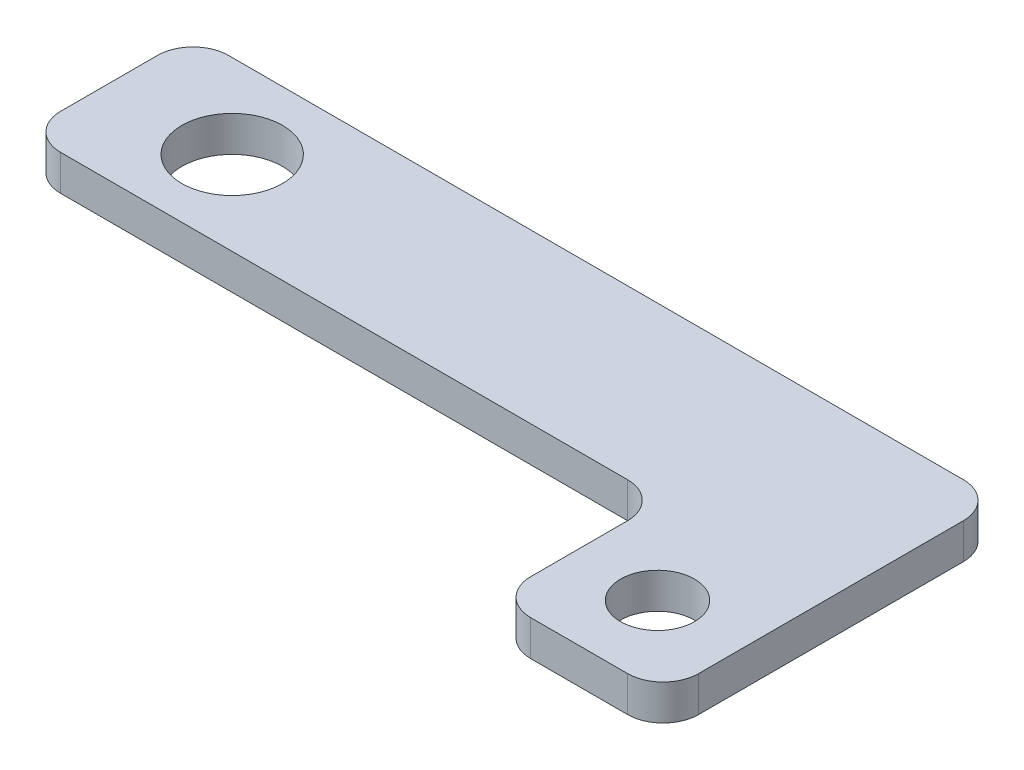
ISO-10303-21;
HEADER;
FILE_DESCRIPTION(('STEP AP214'),'2;1');
FILE_NAME('part.step','',(''),(''),'','','');
FILE_SCHEMA(('AUTOMOTIVE_DESIGN { 1 0 10303 214 1 1 1 1 }'));
ENDSEC;
DATA;
#1=APPLICATION_CONTEXT('core data for automotive mechanical design processes');
#2=APPLICATION_PROTOCOL_DEFINITION('international standard','automotive_design',2000,#1);
#3=PRODUCT_CONTEXT('',#1,'mechanical');
#4=PRODUCT('Part','Part','',(#3));
#5=PRODUCT_RELATED_PRODUCT_CATEGORY('part','',(#4));
#6=PRODUCT_DEFINITION_FORMATION('','',#4);
#7=PRODUCT_DEFINITION_CONTEXT('part definition',#1,'design');
#8=PRODUCT_DEFINITION('design','',#6,#7);
#9=PRODUCT_DEFINITION_SHAPE('','',#8);
#10=(LENGTH_UNIT() NAMED_UNIT(*) SI_UNIT(.MILLI.,.METRE.));
#11=(NAMED_UNIT(*) PLANE_ANGLE_UNIT() SI_UNIT($,.RADIAN.));
#12=(NAMED_UNIT(*) SI_UNIT($,.STERADIAN.) SOLID_ANGLE_UNIT());
#13=UNCERTAINTY_MEASURE_WITH_UNIT(LENGTH_MEASURE(1.E-05),#10,'distance_accuracy_value','');
#14=(GEOMETRIC_REPRESENTATION_CONTEXT(3) GLOBAL_UNCERTAINTY_ASSIGNED_CONTEXT((#13)) GLOBAL_UNIT_ASSIGNED_CONTEXT((#10,
#11,#12)) REPRESENTATION_CONTEXT('',''));
#15=CARTESIAN_POINT('',(0.,0.,0.));
#16=DIRECTION('',(0.,0.,1.));
#17=DIRECTION('',(1.,0.,0.));
#18=AXIS2_PLACEMENT_3D('',#15,#16,#17);
#19=CARTESIAN_POINT('',(56.0000000000009,-3.175,51.0812086000005));
#20=DIRECTION('',(0.,0.,1.));
#21=DIRECTION('',(1.,0.,0.));
#22=AXIS2_PLACEMENT_3D('',#19,#20,#21);
#23=PLANE('',#22);
#24=DIRECTION('',(1.,0.,0.));
#25=VECTOR('',#24,1.);
#26=CARTESIAN_POINT('',(56.0000000000009,-3.175,51.0812086000005));
#27=LINE('',#26,#25);
#28=CARTESIAN_POINT('',(59.1750000000009,-3.175,51.0812086000005));
#29=VERTEX_POINT('',#28);
#30=CARTESIAN_POINT('',(67.8250000000009,-3.175,51.0812086000005));
#31=VERTEX_POINT('',#30);
#32=EDGE_CURVE('E158',#29,#31,#27,.T.);
#33=ORIENTED_EDGE('',*,*,#32,.T.);
#34=DIRECTION('',(0.,1.,0.));
#35=VECTOR('',#34,1.);
#36=CARTESIAN_POINT('',(67.8250000000009,-3.175,51.0812086000005));
#37=LINE('',#36,#35);
#38=CARTESIAN_POINT('',(67.8250000000009,0.,51.0812086000005));
#39=VERTEX_POINT('',#38);
#40=EDGE_CURVE('E202',#31,#39,#37,.T.);
#41=ORIENTED_EDGE('',*,*,#40,.T.);
#42=DIRECTION('',(1.,0.,0.));
#43=VECTOR('',#42,1.);
#44=CARTESIAN_POINT('',(56.0000000000009,0.,51.0812086000005));
#45=LINE('',#44,#43);
#46=CARTESIAN_POINT('',(59.1750000000009,0.,51.0812086000005));
#47=VERTEX_POINT('',#46);
#48=EDGE_CURVE('E136',#47,#39,#45,.T.);
#49=ORIENTED_EDGE('',*,*,#48,.F.);
#50=DIRECTION('',(0.,1.,0.));
#51=VECTOR('',#50,1.);
#52=CARTESIAN_POINT('',(59.1750000000009,-3.175,51.0812086000005));
#53=LINE('',#52,#51);
#54=EDGE_CURVE('E200',#47,#29,#53,.F.);
#55=ORIENTED_EDGE('',*,*,#54,.T.);
#56=EDGE_LOOP('',(#33,#41,#49,#55));
#57=FACE_BOUND('',#56,.T.);
#58=ADVANCED_FACE('F41',(#57),#23,.T.);
#59=CARTESIAN_POINT('',(56.0000000000009,-3.175,44.0812086000005));
#60=DIRECTION('',(-1.,0.,0.));
#61=DIRECTION('',(0.,0.,1.));
#62=AXIS2_PLACEMENT_3D('',#59,#60,#61);
#63=PLANE('',#62);
#64=DIRECTION('',(0.,0.,1.));
#65=VECTOR('',#64,1.);
#66=CARTESIAN_POINT('',(56.0000000000009,0.,44.0812086000005));
#67=LINE('',#66,#65);
#68=CARTESIAN_POINT('',(56.0000000000009,0.,39.2562086000132));
#69=VERTEX_POINT('',#68);
#70=CARTESIAN_POINT('',(56.0000000000009,0.,47.9062086000005));
#71=VERTEX_POINT('',#70);
#72=EDGE_CURVE('E206',#69,#71,#67,.T.);
#73=ORIENTED_EDGE('',*,*,#72,.F.);
#74=DIRECTION('',(0.,1.,0.));
#75=VECTOR('',#74,1.);
#76=CARTESIAN_POINT('',(56.0000000000009,-3.175,39.2562086000132));
#77=LINE('',#76,#75);
#78=CARTESIAN_POINT('',(56.0000000000009,-3.175,39.2562086000132));
#79=VERTEX_POINT('',#78);
#80=EDGE_CURVE('E198',#69,#79,#77,.F.);
#81=ORIENTED_EDGE('',*,*,#80,.T.);
#82=DIRECTION('',(0.,0.,1.));
#83=VECTOR('',#82,1.);
#84=CARTESIAN_POINT('',(56.0000000000009,-3.175,36.0812086000132));
#85=LINE('',#84,#83);
#86=CARTESIAN_POINT('',(56.0000000000009,-3.175,47.9062086000005));
#87=VERTEX_POINT('',#86);
#88=EDGE_CURVE('E162',#79,#87,#85,.T.);
#89=ORIENTED_EDGE('',*,*,#88,.T.);
#90=DIRECTION('',(0.,1.,0.));
#91=VECTOR('',#90,1.);
#92=CARTESIAN_POINT('',(56.0000000000009,-3.175,47.9062086000005));
#93=LINE('',#92,#91);
#94=EDGE_CURVE('E195',#87,#71,#93,.T.);
#95=ORIENTED_EDGE('',*,*,#94,.T.);
#96=EDGE_LOOP('',(#73,#81,#89,#95));
#97=FACE_BOUND('',#96,.T.);
#98=ADVANCED_FACE('F213',(#97),#63,.T.);
#99=CARTESIAN_POINT('',(9.99999999999999,-3.175,36.0812086000132));
#100=DIRECTION('',(0.,0.,1.));
#101=DIRECTION('',(1.,0.,0.));
#102=AXIS2_PLACEMENT_3D('',#99,#100,#101);
#103=PLANE('',#102);
#104=DIRECTION('',(1.,0.,0.));
#105=VECTOR('',#104,1.);
#106=CARTESIAN_POINT('',(9.99999999999999,0.,36.0812086000132));
#107=LINE('',#106,#105);
#108=CARTESIAN_POINT('',(2.17499999999999,0.,36.0812086000132));
#109=VERTEX_POINT('',#108);
#110=CARTESIAN_POINT('',(52.8250000000009,0.,36.0812086000132));
#111=VERTEX_POINT('',#110);
#112=EDGE_CURVE('E208',#109,#111,#107,.T.);
#113=ORIENTED_EDGE('',*,*,#112,.F.);
#114=DIRECTION('',(0.,1.,0.));
#115=VECTOR('',#114,1.);
#116=CARTESIAN_POINT('',(2.17499999999999,-3.175,36.0812086000132));
#117=LINE('',#116,#115);
#118=CARTESIAN_POINT('',(2.17499999999999,-3.175,36.0812086000132));
#119=VERTEX_POINT('',#118);
#120=EDGE_CURVE('E193',#109,#119,#117,.F.);
#121=ORIENTED_EDGE('',*,*,#120,.T.);
#122=DIRECTION('',(1.,0.,0.));
#123=VECTOR('',#122,1.);
#124=CARTESIAN_POINT('',(-1.00000000000001,-3.175,36.0812086000132));
#125=LINE('',#124,#123);
#126=CARTESIAN_POINT('',(52.8250000000009,-3.175,36.0812086000132));
#127=VERTEX_POINT('',#126);
#128=EDGE_CURVE('E222',#119,#127,#125,.T.);
#129=ORIENTED_EDGE('',*,*,#128,.T.);
#130=DIRECTION('',(0.,1.,0.));
#131=VECTOR('',#130,1.);
#132=CARTESIAN_POINT('',(52.8250000000009,0.,36.0812086000132));
#133=LINE('',#132,#131);
#134=EDGE_CURVE('E190',#127,#111,#133,.T.);
#135=ORIENTED_EDGE('',*,*,#134,.T.);
#136=EDGE_LOOP('',(#113,#121,#129,#135));
#137=FACE_BOUND('',#136,.T.);
#138=ADVANCED_FACE('F224',(#137),#103,.T.);
#139=CARTESIAN_POINT('',(-1.00000000000001,-3.175,21.0812086000132));
#140=DIRECTION('',(-1.,0.,0.));
#141=DIRECTION('',(0.,0.,1.));
#142=AXIS2_PLACEMENT_3D('',#139,#140,#141);
#143=PLANE('',#142);
#144=DIRECTION('',(0.,0.,1.));
#145=VECTOR('',#144,1.);
#146=CARTESIAN_POINT('',(-1.00000000000001,0.,21.0812086000132));
#147=LINE('',#146,#145);
#148=CARTESIAN_POINT('',(-1.00000000000001,0.,24.2562086000132));
#149=VERTEX_POINT('',#148);
#150=CARTESIAN_POINT('',(-1.00000000000001,0.,32.9062086000132));
#151=VERTEX_POINT('',#150);
#152=EDGE_CURVE('E235',#149,#151,#147,.T.);
#153=ORIENTED_EDGE('',*,*,#152,.F.);
#154=DIRECTION('',(0.,1.,0.));
#155=VECTOR('',#154,1.);
#156=CARTESIAN_POINT('',(-1.00000000000001,-3.175,24.2562086000132));
#157=LINE('',#156,#155);
#158=CARTESIAN_POINT('',(-1.00000000000001,-3.175,24.2562086000132));
#159=VERTEX_POINT('',#158);
#160=EDGE_CURVE('E63',#149,#159,#157,.F.);
#161=ORIENTED_EDGE('',*,*,#160,.T.);
#162=DIRECTION('',(0.,0.,1.));
#163=VECTOR('',#162,1.);
#164=CARTESIAN_POINT('',(-1.00000000000001,-3.175,21.0812086000132));
#165=LINE('',#164,#163);
#166=CARTESIAN_POINT('',(-1.00000000000001,-3.175,32.9062086000132));
#167=VERTEX_POINT('',#166);
#168=EDGE_CURVE('E226',#159,#167,#165,.T.);
#169=ORIENTED_EDGE('',*,*,#168,.T.);
#170=DIRECTION('',(0.,1.,0.));
#171=VECTOR('',#170,1.);
#172=CARTESIAN_POINT('',(-1.00000000000001,-3.175,32.9062086000132));
#173=LINE('',#172,#171);
#174=EDGE_CURVE('E186',#167,#151,#173,.T.);
#175=ORIENTED_EDGE('',*,*,#174,.T.);
#176=EDGE_LOOP('',(#153,#161,#169,#175));
#177=FACE_BOUND('',#176,.T.);
#178=ADVANCED_FACE('F238',(#177),#143,.T.);
#179=CARTESIAN_POINT('',(9.99999999999998,-3.175,21.0812086000132));
#180=DIRECTION('',(0.,0.,-1.));
#181=DIRECTION('',(-1.,0.,0.));
#182=AXIS2_PLACEMENT_3D('',#179,#180,#181);
#183=PLANE('',#182);
#184=DIRECTION('',(-1.,0.,0.));
#185=VECTOR('',#184,1.);
#186=CARTESIAN_POINT('',(9.99999999999998,0.,21.0812086000132));
#187=LINE('',#186,#185);
#188=CARTESIAN_POINT('',(67.8250000000009,0.,21.0812086000132));
#189=VERTEX_POINT('',#188);
#190=CARTESIAN_POINT('',(2.17499999999999,0.,21.0812086000132));
#191=VERTEX_POINT('',#190);
#192=EDGE_CURVE('E152',#189,#191,#187,.T.);
#193=ORIENTED_EDGE('',*,*,#192,.F.);
#194=DIRECTION('',(0.,1.,0.));
#195=VECTOR('',#194,1.);
#196=CARTESIAN_POINT('',(67.8250000000009,-3.175,21.0812086000132));
#197=LINE('',#196,#195);
#198=CARTESIAN_POINT('',(67.8250000000009,-3.175,21.0812086000132));
#199=VERTEX_POINT('',#198);
#200=EDGE_CURVE('E176',#189,#199,#197,.F.);
#201=ORIENTED_EDGE('',*,*,#200,.T.);
#202=DIRECTION('',(-1.,0.,0.));
#203=VECTOR('',#202,1.);
#204=CARTESIAN_POINT('',(9.99999999999998,-3.175,21.0812086000132));
#205=LINE('',#204,#203);
#206=CARTESIAN_POINT('',(2.17499999999999,-3.175,21.0812086000132));
#207=VERTEX_POINT('',#206);
#208=EDGE_CURVE('E229',#199,#207,#205,.T.);
#209=ORIENTED_EDGE('',*,*,#208,.T.);
#210=DIRECTION('',(0.,1.,0.));
#211=VECTOR('',#210,1.);
#212=CARTESIAN_POINT('',(2.17499999999999,-3.175,21.0812086000132));
#213=LINE('',#212,#211);
#214=EDGE_CURVE('E173',#207,#191,#213,.T.);
#215=ORIENTED_EDGE('',*,*,#214,.T.);
#216=EDGE_LOOP('',(#193,#201,#209,#215));
#217=FACE_BOUND('',#216,.T.);
#218=ADVANCED_FACE('F248',(#217),#183,.T.);
#219=CARTESIAN_POINT('',(71.0000000000009,-3.175,21.0812086000132));
#220=DIRECTION('',(1.,0.,0.));
#221=DIRECTION('',(0.,0.,-1.));
#222=AXIS2_PLACEMENT_3D('',#219,#220,#221);
#223=PLANE('',#222);
#224=DIRECTION('',(0.,0.,-1.));
#225=VECTOR('',#224,1.);
#226=CARTESIAN_POINT('',(71.0000000000009,-3.175,51.0812086000005));
#227=LINE('',#226,#225);
#228=CARTESIAN_POINT('',(71.0000000000009,-3.175,47.9062086000005));
#229=VERTEX_POINT('',#228);
#230=CARTESIAN_POINT('',(71.0000000000009,-3.175,24.2562086000132));
#231=VERTEX_POINT('',#230);
#232=EDGE_CURVE('E250',#229,#231,#227,.T.);
#233=ORIENTED_EDGE('',*,*,#232,.T.);
#234=DIRECTION('',(0.,1.,0.));
#235=VECTOR('',#234,1.);
#236=CARTESIAN_POINT('',(71.0000000000009,-3.175,24.2562086000132));
#237=LINE('',#236,#235);
#238=CARTESIAN_POINT('',(71.0000000000009,0.,24.2562086000132));
#239=VERTEX_POINT('',#238);
#240=EDGE_CURVE('E151',#231,#239,#237,.T.);
#241=ORIENTED_EDGE('',*,*,#240,.T.);
#242=DIRECTION('',(0.,0.,-1.));
#243=VECTOR('',#242,1.);
#244=CARTESIAN_POINT('',(71.0000000000009,0.,21.0812086000132));
#245=LINE('',#244,#243);
#246=CARTESIAN_POINT('',(71.0000000000009,0.,47.9062086000005));
#247=VERTEX_POINT('',#246);
#248=EDGE_CURVE('E134',#247,#239,#245,.T.);
#249=ORIENTED_EDGE('',*,*,#248,.F.);
#250=DIRECTION('',(0.,1.,0.));
#251=VECTOR('',#250,1.);
#252=CARTESIAN_POINT('',(71.0000000000009,-3.175,47.9062086000005));
#253=LINE('',#252,#251);
#254=EDGE_CURVE('E148',#247,#229,#253,.F.);
#255=ORIENTED_EDGE('',*,*,#254,.T.);
#256=EDGE_LOOP('',(#233,#241,#249,#255));
#257=FACE_BOUND('',#256,.T.);
#258=ADVANCED_FACE('F147',(#257),#223,.T.);
#259=CARTESIAN_POINT('',(0.,-3.175,0.));
#260=DIRECTION('',(0.,-1.,0.));
#261=DIRECTION('',(0.,0.,-1.));
#262=AXIS2_PLACEMENT_3D('',#259,#260,#261);
#263=PLANE('',#262);
#264=CARTESIAN_POINT('',(63.5000000000009,-3.175,44.0812086000005));
#265=DIRECTION('',(0.,-1.,0.));
#266=DIRECTION('',(0.,0.,-1.));
#267=AXIS2_PLACEMENT_3D('',#264,#265,#266);
#268=CIRCLE('',#267,3.3);
#269=CARTESIAN_POINT('',(63.5000000000009,-3.175,40.7812086000005));
#270=VERTEX_POINT('',#269);
#271=EDGE_CURVE('E261',#270,#270,#268,.T.);
#272=ORIENTED_EDGE('',*,*,#271,.F.);
#273=EDGE_LOOP('',(#272));
#274=FACE_BOUND('',#273,.T.);
#275=CARTESIAN_POINT('',(9.99999999999999,-3.175,28.5812086000132));
#276=DIRECTION('',(0.,-1.,0.));
#277=DIRECTION('',(0.,0.,-1.));
#278=AXIS2_PLACEMENT_3D('',#275,#276,#277);
#279=CIRCLE('',#278,4.5);
#280=CARTESIAN_POINT('',(9.99999999999999,-3.175,24.0812086000132));
#281=VERTEX_POINT('',#280);
#282=EDGE_CURVE('E255',#281,#281,#279,.T.);
#283=ORIENTED_EDGE('',*,*,#282,.F.);
#284=EDGE_LOOP('',(#283));
#285=FACE_BOUND('',#284,.T.);
#286=ORIENTED_EDGE('',*,*,#208,.F.);
#287=CARTESIAN_POINT('',(67.8250000000009,-3.175,24.2562086000132));
#288=DIRECTION('',(0.,-1.,0.));
#289=DIRECTION('',(0.,0.,-1.));
#290=AXIS2_PLACEMENT_3D('',#287,#288,#289);
#291=CIRCLE('',#290,3.175);
#292=EDGE_CURVE('E184',#199,#231,#291,.T.);
#293=ORIENTED_EDGE('',*,*,#292,.T.);
#294=ORIENTED_EDGE('',*,*,#232,.F.);
#295=CARTESIAN_POINT('',(67.8250000000009,-3.175,47.9062086000005));
#296=DIRECTION('',(0.,-1.,0.));
#297=DIRECTION('',(0.,0.,-1.));
#298=AXIS2_PLACEMENT_3D('',#295,#296,#297);
#299=CIRCLE('',#298,3.175);
#300=EDGE_CURVE('E157',#229,#31,#299,.T.);
#301=ORIENTED_EDGE('',*,*,#300,.T.);
#302=ORIENTED_EDGE('',*,*,#32,.F.);
#303=CARTESIAN_POINT('',(59.1750000000009,-3.175,47.9062086000005));
#304=DIRECTION('',(0.,-1.,0.));
#305=DIRECTION('',(0.,0.,-1.));
#306=AXIS2_PLACEMENT_3D('',#303,#304,#305);
#307=CIRCLE('',#306,3.175);
#308=EDGE_CURVE('E178',#29,#87,#307,.T.);
#309=ORIENTED_EDGE('',*,*,#308,.T.);
#310=ORIENTED_EDGE('',*,*,#88,.F.);
#311=CARTESIAN_POINT('',(52.8250000000009,-3.175,39.2562086000132));
#312=DIRECTION('',(0.,-1.,0.));
#313=DIRECTION('',(0.,0.,-1.));
#314=AXIS2_PLACEMENT_3D('',#311,#312,#313);
#315=CIRCLE('',#314,3.175);
#316=EDGE_CURVE('E11',#79,#127,#315,.F.);
#317=ORIENTED_EDGE('',*,*,#316,.T.);
#318=ORIENTED_EDGE('',*,*,#128,.F.);
#319=CARTESIAN_POINT('',(2.17499999999999,-3.175,32.9062086000132));
#320=DIRECTION('',(0.,-1.,0.));
#321=DIRECTION('',(0.,0.,-1.));
#322=AXIS2_PLACEMENT_3D('',#319,#320,#321);
#323=CIRCLE('',#322,3.175);
#324=EDGE_CURVE('E56',#119,#167,#323,.T.);
#325=ORIENTED_EDGE('',*,*,#324,.T.);
#326=ORIENTED_EDGE('',*,*,#168,.F.);
#327=CARTESIAN_POINT('',(2.17499999999999,-3.175,24.2562086000132));
#328=DIRECTION('',(0.,-1.,0.));
#329=DIRECTION('',(0.,0.,-1.));
#330=AXIS2_PLACEMENT_3D('',#327,#328,#329);
#331=CIRCLE('',#330,3.175);
#332=EDGE_CURVE('E182',#159,#207,#331,.T.);
#333=ORIENTED_EDGE('',*,*,#332,.T.);
#334=EDGE_LOOP('',(#286,#293,#294,#301,#302,#309,#310,#317,#318,#325,#326,#333));
#335=FACE_BOUND('',#334,.T.);
#336=ADVANCED_FACE('F221',(#274,#285,#335),#263,.T.);
#337=CARTESIAN_POINT('',(0.,0.,0.));
#338=DIRECTION('',(0.,-1.,0.));
#339=DIRECTION('',(0.,0.,-1.));
#340=AXIS2_PLACEMENT_3D('',#337,#338,#339);
#341=PLANE('',#340);
#342=CARTESIAN_POINT('',(63.5000000000009,0.,44.0812086000005));
#343=DIRECTION('',(0.,-1.,0.));
#344=DIRECTION('',(0.,0.,-1.));
#345=AXIS2_PLACEMENT_3D('',#342,#343,#344);
#346=CIRCLE('',#345,3.3);
#347=CARTESIAN_POINT('',(63.5000000000009,0.,40.7812086000005));
#348=VERTEX_POINT('',#347);
#349=EDGE_CURVE('E258',#348,#348,#346,.T.);
#350=ORIENTED_EDGE('',*,*,#349,.T.);
#351=EDGE_LOOP('',(#350));
#352=FACE_BOUND('',#351,.T.);
#353=CARTESIAN_POINT('',(9.99999999999999,0.,28.5812086000132));
#354=DIRECTION('',(0.,-1.,0.));
#355=DIRECTION('',(0.,0.,-1.));
#356=AXIS2_PLACEMENT_3D('',#353,#354,#355);
#357=CIRCLE('',#356,4.5);
#358=CARTESIAN_POINT('',(9.99999999999999,0.,24.0812086000132));
#359=VERTEX_POINT('',#358);
#360=EDGE_CURVE('E153',#359,#359,#357,.T.);
#361=ORIENTED_EDGE('',*,*,#360,.T.);
#362=EDGE_LOOP('',(#361));
#363=FACE_BOUND('',#362,.T.);
#364=ORIENTED_EDGE('',*,*,#248,.T.);
#365=CARTESIAN_POINT('',(67.8250000000009,0.,24.2562086000132));
#366=DIRECTION('',(0.,-1.,0.));
#367=DIRECTION('',(0.,0.,-1.));
#368=AXIS2_PLACEMENT_3D('',#365,#366,#367);
#369=CIRCLE('',#368,3.175);
#370=EDGE_CURVE('E171',#239,#189,#369,.F.);
#371=ORIENTED_EDGE('',*,*,#370,.T.);
#372=ORIENTED_EDGE('',*,*,#192,.T.);
#373=CARTESIAN_POINT('',(2.17499999999999,0.,24.2562086000132));
#374=DIRECTION('',(0.,-1.,0.));
#375=DIRECTION('',(0.,0.,-1.));
#376=AXIS2_PLACEMENT_3D('',#373,#374,#375);
#377=CIRCLE('',#376,3.175);
#378=EDGE_CURVE('E169',#191,#149,#377,.F.);
#379=ORIENTED_EDGE('',*,*,#378,.T.);
#380=ORIENTED_EDGE('',*,*,#152,.T.);
#381=CARTESIAN_POINT('',(2.17499999999999,0.,32.9062086000132));
#382=DIRECTION('',(0.,-1.,0.));
#383=DIRECTION('',(0.,0.,-1.));
#384=AXIS2_PLACEMENT_3D('',#381,#382,#383);
#385=CIRCLE('',#384,3.175);
#386=EDGE_CURVE('E141',#151,#109,#385,.F.);
#387=ORIENTED_EDGE('',*,*,#386,.T.);
#388=ORIENTED_EDGE('',*,*,#112,.T.);
#389=CARTESIAN_POINT('',(52.8250000000009,0.,39.2562086000132));
#390=DIRECTION('',(0.,-1.,0.));
#391=DIRECTION('',(0.,0.,-1.));
#392=AXIS2_PLACEMENT_3D('',#389,#390,#391);
#393=CIRCLE('',#392,3.175);
#394=EDGE_CURVE('E49',#111,#69,#393,.T.);
#395=ORIENTED_EDGE('',*,*,#394,.T.);
#396=ORIENTED_EDGE('',*,*,#72,.T.);
#397=CARTESIAN_POINT('',(59.1750000000009,0.,47.9062086000005));
#398=DIRECTION('',(0.,-1.,0.));
#399=DIRECTION('',(0.,0.,-1.));
#400=AXIS2_PLACEMENT_3D('',#397,#398,#399);
#401=CIRCLE('',#400,3.175);
#402=EDGE_CURVE('E142',#71,#47,#401,.F.);
#403=ORIENTED_EDGE('',*,*,#402,.T.);
#404=ORIENTED_EDGE('',*,*,#48,.T.);
#405=CARTESIAN_POINT('',(67.8250000000009,0.,47.9062086000005));
#406=DIRECTION('',(0.,-1.,0.));
#407=DIRECTION('',(0.,0.,-1.));
#408=AXIS2_PLACEMENT_3D('',#405,#406,#407);
#409=CIRCLE('',#408,3.175);
#410=EDGE_CURVE('E131',#39,#247,#409,.F.);
#411=ORIENTED_EDGE('',*,*,#410,.T.);
#412=EDGE_LOOP('',(#364,#371,#372,#379,#380,#387,#388,#395,#396,#403,#404,#411));
#413=FACE_BOUND('',#412,.T.);
#414=ADVANCED_FACE('F133',(#352,#363,#413),#341,.F.);
#415=CARTESIAN_POINT('',(9.99999999999999,-3.175,28.5812086000132));
#416=DIRECTION('',(0.,-1.,0.));
#417=DIRECTION('',(0.,0.,-1.));
#418=AXIS2_PLACEMENT_3D('',#415,#416,#417);
#419=CYLINDRICAL_SURFACE('',#418,4.5);
#420=ORIENTED_EDGE('',*,*,#360,.F.);
#421=EDGE_LOOP('',(#420));
#422=FACE_BOUND('',#421,.T.);
#423=ORIENTED_EDGE('',*,*,#282,.T.);
#424=EDGE_LOOP('',(#423));
#425=FACE_BOUND('',#424,.T.);
#426=ADVANCED_FACE('F272',(#422,#425),#419,.F.);
#427=CARTESIAN_POINT('',(63.5000000000009,-3.175,44.0812086000005));
#428=DIRECTION('',(0.,-1.,0.));
#429=DIRECTION('',(0.,0.,-1.));
#430=AXIS2_PLACEMENT_3D('',#427,#428,#429);
#431=CYLINDRICAL_SURFACE('',#430,3.3);
#432=ORIENTED_EDGE('',*,*,#349,.F.);
#433=EDGE_LOOP('',(#432));
#434=FACE_BOUND('',#433,.T.);
#435=ORIENTED_EDGE('',*,*,#271,.T.);
#436=EDGE_LOOP('',(#435));
#437=FACE_BOUND('',#436,.T.);
#438=ADVANCED_FACE('F265',(#434,#437),#431,.F.);
#439=CARTESIAN_POINT('',(67.8250000000009,-3.175,24.2562086000132));
#440=DIRECTION('',(0.,1.,0.));
#441=DIRECTION('',(0.,0.,1.));
#442=AXIS2_PLACEMENT_3D('',#439,#440,#441);
#443=CYLINDRICAL_SURFACE('',#442,3.175);
#444=ORIENTED_EDGE('',*,*,#292,.F.);
#445=ORIENTED_EDGE('',*,*,#200,.F.);
#446=ORIENTED_EDGE('',*,*,#370,.F.);
#447=ORIENTED_EDGE('',*,*,#240,.F.);
#448=EDGE_LOOP('',(#444,#445,#446,#447));
#449=FACE_BOUND('',#448,.T.);
#450=ADVANCED_FACE('F279',(#449),#443,.T.);
#451=CARTESIAN_POINT('',(2.17499999999999,-3.175,24.2562086000132));
#452=DIRECTION('',(0.,1.,0.));
#453=DIRECTION('',(0.,0.,1.));
#454=AXIS2_PLACEMENT_3D('',#451,#452,#453);
#455=CYLINDRICAL_SURFACE('',#454,3.175);
#456=ORIENTED_EDGE('',*,*,#332,.F.);
#457=ORIENTED_EDGE('',*,*,#160,.F.);
#458=ORIENTED_EDGE('',*,*,#378,.F.);
#459=ORIENTED_EDGE('',*,*,#214,.F.);
#460=EDGE_LOOP('',(#456,#457,#458,#459));
#461=FACE_BOUND('',#460,.T.);
#462=ADVANCED_FACE('F242',(#461),#455,.T.);
#463=CARTESIAN_POINT('',(2.17499999999999,-3.175,32.9062086000132));
#464=DIRECTION('',(0.,1.,0.));
#465=DIRECTION('',(0.,0.,1.));
#466=AXIS2_PLACEMENT_3D('',#463,#464,#465);
#467=CYLINDRICAL_SURFACE('',#466,3.175);
#468=ORIENTED_EDGE('',*,*,#324,.F.);
#469=ORIENTED_EDGE('',*,*,#120,.F.);
#470=ORIENTED_EDGE('',*,*,#386,.F.);
#471=ORIENTED_EDGE('',*,*,#174,.F.);
#472=EDGE_LOOP('',(#468,#469,#470,#471));
#473=FACE_BOUND('',#472,.T.);
#474=ADVANCED_FACE('F307',(#473),#467,.T.);
#475=CARTESIAN_POINT('',(52.8250000000009,-3.175,39.2562086000132));
#476=DIRECTION('',(0.,-1.,0.));
#477=DIRECTION('',(0.,0.,-1.));
#478=AXIS2_PLACEMENT_3D('',#475,#476,#477);
#479=CYLINDRICAL_SURFACE('',#478,3.175);
#480=ORIENTED_EDGE('',*,*,#316,.F.);
#481=ORIENTED_EDGE('',*,*,#80,.F.);
#482=ORIENTED_EDGE('',*,*,#394,.F.);
#483=ORIENTED_EDGE('',*,*,#134,.F.);
#484=EDGE_LOOP('',(#480,#481,#482,#483));
#485=FACE_BOUND('',#484,.T.);
#486=ADVANCED_FACE('F218',(#485),#479,.F.);
#487=CARTESIAN_POINT('',(67.8250000000009,-3.175,47.9062086000005));
#488=DIRECTION('',(0.,1.,0.));
#489=DIRECTION('',(0.,0.,1.));
#490=AXIS2_PLACEMENT_3D('',#487,#488,#489);
#491=CYLINDRICAL_SURFACE('',#490,3.175);
#492=ORIENTED_EDGE('',*,*,#300,.F.);
#493=ORIENTED_EDGE('',*,*,#254,.F.);
#494=ORIENTED_EDGE('',*,*,#410,.F.);
#495=ORIENTED_EDGE('',*,*,#40,.F.);
#496=EDGE_LOOP('',(#492,#493,#494,#495));
#497=FACE_BOUND('',#496,.T.);
#498=ADVANCED_FACE('F156',(#497),#491,.T.);
#499=CARTESIAN_POINT('',(59.1750000000009,-3.175,47.9062086000005));
#500=DIRECTION('',(0.,1.,0.));
#501=DIRECTION('',(0.,0.,1.));
#502=AXIS2_PLACEMENT_3D('',#499,#500,#501);
#503=CYLINDRICAL_SURFACE('',#502,3.175);
#504=ORIENTED_EDGE('',*,*,#308,.F.);
#505=ORIENTED_EDGE('',*,*,#54,.F.);
#506=ORIENTED_EDGE('',*,*,#402,.F.);
#507=ORIENTED_EDGE('',*,*,#94,.F.);
#508=EDGE_LOOP('',(#504,#505,#506,#507));
#509=FACE_BOUND('',#508,.T.);
#510=ADVANCED_FACE('F43',(#509),#503,.T.);
#511=CLOSED_SHELL('',(#58,#98,#138,#178,#218,#258,#336,#414,#426,#438,#450,#462,#474,#486,#498,#510));
#512=MANIFOLD_SOLID_BREP('B2',#511);
#513=ADVANCED_BREP_SHAPE_REPRESENTATION('',(#18,#512),#14);
#514=SHAPE_DEFINITION_REPRESENTATION(#9,#513);
ENDSEC;
END-ISO-10303-21;
